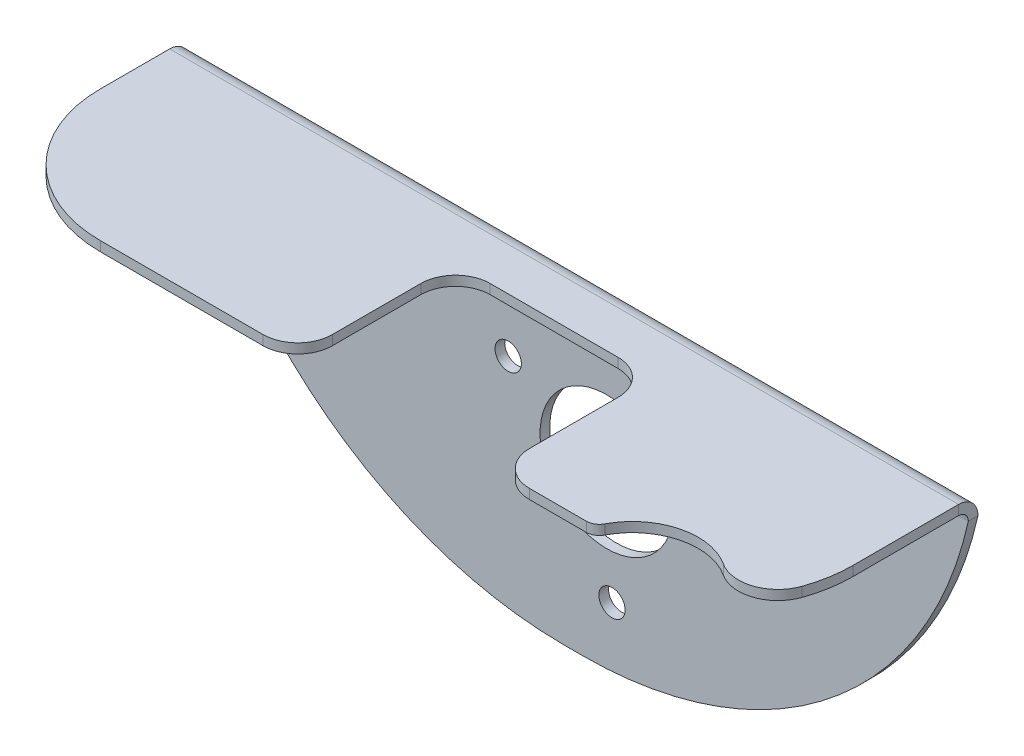
ISO-10303-21;
HEADER;
FILE_DESCRIPTION(('STEP AP214'),'2;1');
FILE_NAME('part.step','',(''),(''),'','','');
FILE_SCHEMA(('AUTOMOTIVE_DESIGN { 1 0 10303 214 1 1 1 1 }'));
ENDSEC;
DATA;
#1=APPLICATION_CONTEXT('core data for automotive mechanical design processes');
#2=APPLICATION_PROTOCOL_DEFINITION('international standard','automotive_design',2000,#1);
#3=PRODUCT_CONTEXT('',#1,'mechanical');
#4=PRODUCT('Part','Part','',(#3));
#5=PRODUCT_RELATED_PRODUCT_CATEGORY('part','',(#4));
#6=PRODUCT_DEFINITION_FORMATION('','',#4);
#7=PRODUCT_DEFINITION_CONTEXT('part definition',#1,'design');
#8=PRODUCT_DEFINITION('design','',#6,#7);
#9=PRODUCT_DEFINITION_SHAPE('','',#8);
#10=(LENGTH_UNIT() NAMED_UNIT(*) SI_UNIT(.MILLI.,.METRE.));
#11=(NAMED_UNIT(*) PLANE_ANGLE_UNIT() SI_UNIT($,.RADIAN.));
#12=(NAMED_UNIT(*) SI_UNIT($,.STERADIAN.) SOLID_ANGLE_UNIT());
#13=UNCERTAINTY_MEASURE_WITH_UNIT(LENGTH_MEASURE(1.E-05),#10,'distance_accuracy_value','');
#14=(GEOMETRIC_REPRESENTATION_CONTEXT(3) GLOBAL_UNCERTAINTY_ASSIGNED_CONTEXT((#13)) GLOBAL_UNIT_ASSIGNED_CONTEXT((#10,
#11,#12)) REPRESENTATION_CONTEXT('',''));
#15=CARTESIAN_POINT('',(0.,0.,0.));
#16=DIRECTION('',(0.,0.,1.));
#17=DIRECTION('',(1.,0.,0.));
#18=AXIS2_PLACEMENT_3D('',#15,#16,#17);
#19=CARTESIAN_POINT('',(12.6335741699428,-0.7366,7.5));
#20=DIRECTION('',(0.,0.,1.));
#21=DIRECTION('',(1.,0.,0.));
#22=AXIS2_PLACEMENT_3D('',#19,#20,#21);
#23=PLANE('',#22);
#24=DIRECTION('',(1.,0.,0.));
#25=VECTOR('',#24,1.);
#26=CARTESIAN_POINT('',(12.6335741699428,-0.7366,7.5));
#27=LINE('',#26,#25);
#28=CARTESIAN_POINT('',(12.6335741699428,-0.7366,7.5));
#29=VERTEX_POINT('',#28);
#30=CARTESIAN_POINT('',(16.9493208635028,-0.7366,7.5));
#31=VERTEX_POINT('',#30);
#32=EDGE_CURVE('E354',#29,#31,#27,.T.);
#33=ORIENTED_EDGE('',*,*,#32,.T.);
#34=DIRECTION('',(0.,-1.,0.));
#35=VECTOR('',#34,1.);
#36=CARTESIAN_POINT('',(16.9493208635028,-0.7366,7.5));
#37=LINE('',#36,#35);
#38=CARTESIAN_POINT('',(16.9493208635028,0.,7.5));
#39=VERTEX_POINT('',#38);
#40=EDGE_CURVE('E65',#31,#39,#37,.F.);
#41=ORIENTED_EDGE('',*,*,#40,.T.);
#42=DIRECTION('',(1.,0.,0.));
#43=VECTOR('',#42,1.);
#44=CARTESIAN_POINT('',(12.6335741699428,0.,7.5));
#45=LINE('',#44,#43);
#46=CARTESIAN_POINT('',(12.6335741699428,0.,7.5));
#47=VERTEX_POINT('',#46);
#48=EDGE_CURVE('E328',#47,#39,#45,.T.);
#49=ORIENTED_EDGE('',*,*,#48,.F.);
#50=DIRECTION('',(0.,1.,0.));
#51=VECTOR('',#50,1.);
#52=CARTESIAN_POINT('',(12.6335741699428,-0.7366,7.5));
#53=LINE('',#52,#51);
#54=EDGE_CURVE('E385',#29,#47,#53,.T.);
#55=ORIENTED_EDGE('',*,*,#54,.F.);
#56=EDGE_LOOP('',(#33,#41,#49,#55));
#57=FACE_BOUND('',#56,.T.);
#58=ADVANCED_FACE('F57',(#57),#23,.T.);
#59=CARTESIAN_POINT('',(-7.63357416994275,-0.7366,4.86642583005725));
#60=DIRECTION('',(0.,-1.,0.));
#61=DIRECTION('',(0.,0.,-1.));
#62=AXIS2_PLACEMENT_3D('',#59,#60,#61);
#63=PLANE('',#62);
#64=CARTESIAN_POINT('',(22.2559156418227,-0.7366,9.30000925693092));
#65=DIRECTION('',(0.,-1.,0.));
#66=DIRECTION('',(0.,0.,-1.));
#67=AXIS2_PLACEMENT_3D('',#64,#65,#66);
#68=CIRCLE('',#67,4.99999999834926);
#69=CARTESIAN_POINT('',(17.8337533267995,-0.7366,6.96666820961688));
#70=VERTEX_POINT('',#69);
#71=CARTESIAN_POINT('',(24.9766636515534,-0.7366,5.10506822623223));
#72=VERTEX_POINT('',#71);
#73=EDGE_CURVE('E277',#70,#72,#68,.T.);
#74=ORIENTED_EDGE('',*,*,#73,.F.);
#75=CARTESIAN_POINT('',(16.9493208635028,-0.7366,6.5));
#76=DIRECTION('',(0.,-1.,0.));
#77=DIRECTION('',(0.,0.,-1.));
#78=AXIS2_PLACEMENT_3D('',#75,#76,#77);
#79=CIRCLE('',#78,1.);
#80=EDGE_CURVE('E79',#70,#31,#79,.T.);
#81=ORIENTED_EDGE('',*,*,#80,.T.);
#82=ORIENTED_EDGE('',*,*,#32,.F.);
#83=CARTESIAN_POINT('',(12.6335741699428,-0.7366,4.86642583005725));
#84=DIRECTION('',(0.,1.,0.));
#85=DIRECTION('',(0.,0.,1.));
#86=AXIS2_PLACEMENT_3D('',#83,#84,#85);
#87=CIRCLE('',#86,2.63357416994275);
#88=CARTESIAN_POINT('',(10.,-0.7366,4.86642583005725));
#89=VERTEX_POINT('',#88);
#90=EDGE_CURVE('E351',#89,#29,#87,.T.);
#91=ORIENTED_EDGE('',*,*,#90,.F.);
#92=DIRECTION('',(0.,0.,1.));
#93=VECTOR('',#92,1.);
#94=CARTESIAN_POINT('',(10.,-0.7366,-1.86642583005725));
#95=LINE('',#94,#93);
#96=CARTESIAN_POINT('',(10.,-0.7366,-1.86642583005725));
#97=VERTEX_POINT('',#96);
#98=EDGE_CURVE('E348',#97,#89,#95,.T.);
#99=ORIENTED_EDGE('',*,*,#98,.F.);
#100=CARTESIAN_POINT('',(7.36642583005725,-0.7366,-1.86642583005725));
#101=DIRECTION('',(0.,-1.,0.));
#102=DIRECTION('',(0.,0.,-1.));
#103=AXIS2_PLACEMENT_3D('',#100,#101,#102);
#104=CIRCLE('',#103,2.63357416994275);
#105=CARTESIAN_POINT('',(7.36642583005725,-0.7366,-4.5));
#106=VERTEX_POINT('',#105);
#107=EDGE_CURVE('E345',#106,#97,#104,.T.);
#108=ORIENTED_EDGE('',*,*,#107,.F.);
#109=DIRECTION('',(1.,0.,0.));
#110=VECTOR('',#109,1.);
#111=CARTESIAN_POINT('',(-2.36642583005725,-0.7366,-4.5));
#112=LINE('',#111,#110);
#113=CARTESIAN_POINT('',(-2.36642583005725,-0.7366,-4.5));
#114=VERTEX_POINT('',#113);
#115=EDGE_CURVE('E342',#114,#106,#112,.T.);
#116=ORIENTED_EDGE('',*,*,#115,.F.);
#117=CARTESIAN_POINT('',(-2.36642583005725,-0.7366,-1.86642583005725));
#118=DIRECTION('',(0.,-1.,0.));
#119=DIRECTION('',(0.,0.,-1.));
#120=AXIS2_PLACEMENT_3D('',#117,#118,#119);
#121=CIRCLE('',#120,2.63357416994275);
#122=CARTESIAN_POINT('',(-5.,-0.7366,-1.86642583005725));
#123=VERTEX_POINT('',#122);
#124=EDGE_CURVE('E339',#123,#114,#121,.T.);
#125=ORIENTED_EDGE('',*,*,#124,.F.);
#126=DIRECTION('',(0.,0.,-1.));
#127=VECTOR('',#126,1.);
#128=CARTESIAN_POINT('',(-5.,-0.7366,-1.86642583005725));
#129=LINE('',#128,#127);
#130=CARTESIAN_POINT('',(-5.,-0.7366,4.86642583005725));
#131=VERTEX_POINT('',#130);
#132=EDGE_CURVE('E336',#131,#123,#129,.T.);
#133=ORIENTED_EDGE('',*,*,#132,.F.);
#134=CARTESIAN_POINT('',(-7.63357416994275,-0.7366,4.86642583005725));
#135=DIRECTION('',(0.,1.,0.));
#136=DIRECTION('',(0.,0.,-1.));
#137=AXIS2_PLACEMENT_3D('',#134,#135,#136);
#138=CIRCLE('',#137,2.63357416994275);
#139=CARTESIAN_POINT('',(-7.63357416994275,-0.7366,7.5));
#140=VERTEX_POINT('',#139);
#141=EDGE_CURVE('E333',#140,#131,#138,.T.);
#142=ORIENTED_EDGE('',*,*,#141,.F.);
#143=DIRECTION('',(1.,0.,0.));
#144=VECTOR('',#143,1.);
#145=CARTESIAN_POINT('',(-30.,-0.7366,7.5));
#146=LINE('',#145,#144);
#147=CARTESIAN_POINT('',(-20.,-0.7366,7.5));
#148=VERTEX_POINT('',#147);
#149=EDGE_CURVE('E331',#148,#140,#146,.T.);
#150=ORIENTED_EDGE('',*,*,#149,.F.);
#151=CARTESIAN_POINT('',(-20.,-0.7366,-2.5));
#152=DIRECTION('',(0.,-1.,0.));
#153=DIRECTION('',(0.,0.,-1.));
#154=AXIS2_PLACEMENT_3D('',#151,#152,#153);
#155=CIRCLE('',#154,10.);
#156=CARTESIAN_POINT('',(-30.,-0.7366,-2.5));
#157=VERTEX_POINT('',#156);
#158=EDGE_CURVE('E250',#148,#157,#155,.T.);
#159=ORIENTED_EDGE('',*,*,#158,.T.);
#160=DIRECTION('',(0.,0.,1.));
#161=VECTOR('',#160,1.);
#162=CARTESIAN_POINT('',(-30.,-0.7366,7.5));
#163=LINE('',#162,#161);
#164=CARTESIAN_POINT('',(-30.,-0.736600000000003,-7.7634));
#165=VERTEX_POINT('',#164);
#166=EDGE_CURVE('E327',#165,#157,#163,.T.);
#167=ORIENTED_EDGE('',*,*,#166,.F.);
#168=DIRECTION('',(1.,0.,0.));
#169=VECTOR('',#168,1.);
#170=CARTESIAN_POINT('',(30.,-0.736600000000003,-7.7634));
#171=LINE('',#170,#169);
#172=CARTESIAN_POINT('',(30.,-0.736600000000003,-7.7634));
#173=VERTEX_POINT('',#172);
#174=EDGE_CURVE('E317',#173,#165,#171,.F.);
#175=ORIENTED_EDGE('',*,*,#174,.F.);
#176=DIRECTION('',(0.,0.,-1.));
#177=VECTOR('',#176,1.);
#178=CARTESIAN_POINT('',(30.,-0.7366,7.5));
#179=LINE('',#178,#177);
#180=CARTESIAN_POINT('',(30.,-0.7366,0.281670751157906));
#181=VERTEX_POINT('',#180);
#182=EDGE_CURVE('E325',#181,#173,#179,.T.);
#183=ORIENTED_EDGE('',*,*,#182,.F.);
#184=CARTESIAN_POINT('',(20.,-0.7366,0.281670751157906));
#185=DIRECTION('',(0.,-1.,0.));
#186=DIRECTION('',(0.,0.,-1.));
#187=AXIS2_PLACEMENT_3D('',#184,#185,#186);
#188=CIRCLE('',#187,10.);
#189=CARTESIAN_POINT('',(29.4415892256153,-0.7366,3.57657483090668));
#190=VERTEX_POINT('',#189);
#191=EDGE_CURVE('E256',#181,#190,#188,.T.);
#192=ORIENTED_EDGE('',*,*,#191,.T.);
#193=CARTESIAN_POINT('',(26.6091124579307,-0.7366,2.58810360698205));
#194=DIRECTION('',(0.,-1.,0.));
#195=DIRECTION('',(0.,0.,-1.));
#196=AXIS2_PLACEMENT_3D('',#193,#194,#195);
#197=CIRCLE('',#196,3.);
#198=EDGE_CURVE('E262',#190,#72,#197,.T.);
#199=ORIENTED_EDGE('',*,*,#198,.T.);
#200=EDGE_LOOP('',(#74,#81,#82,#91,#99,#108,#116,#125,#133,#142,#150,#159,#167,#175,#183,#192,#199));
#201=FACE_BOUND('',#200,.T.);
#202=ADVANCED_FACE('F281',(#201),#63,.T.);
#203=CARTESIAN_POINT('',(-7.63357416994275,0.,4.86642583005725));
#204=DIRECTION('',(0.,-1.,0.));
#205=DIRECTION('',(0.,0.,-1.));
#206=AXIS2_PLACEMENT_3D('',#203,#204,#205);
#207=PLANE('',#206);
#208=ORIENTED_EDGE('',*,*,#48,.T.);
#209=CARTESIAN_POINT('',(16.9493208635028,0.,6.5));
#210=DIRECTION('',(0.,-1.,0.));
#211=DIRECTION('',(0.,0.,-1.));
#212=AXIS2_PLACEMENT_3D('',#209,#210,#211);
#213=CIRCLE('',#212,1.);
#214=CARTESIAN_POINT('',(17.8337533267995,0.,6.96666820961688));
#215=VERTEX_POINT('',#214);
#216=EDGE_CURVE('E13',#39,#215,#213,.F.);
#217=ORIENTED_EDGE('',*,*,#216,.T.);
#218=CARTESIAN_POINT('',(22.2559156418227,0.,9.30000925693092));
#219=DIRECTION('',(0.,-1.,0.));
#220=DIRECTION('',(0.,0.,-1.));
#221=AXIS2_PLACEMENT_3D('',#218,#219,#220);
#222=CIRCLE('',#221,4.99999999834926);
#223=CARTESIAN_POINT('',(24.9766636515534,0.,5.10506822623223));
#224=VERTEX_POINT('',#223);
#225=EDGE_CURVE('E278',#215,#224,#222,.T.);
#226=ORIENTED_EDGE('',*,*,#225,.T.);
#227=CARTESIAN_POINT('',(26.6091124579307,0.,2.58810360698205));
#228=DIRECTION('',(0.,-1.,0.));
#229=DIRECTION('',(0.,0.,-1.));
#230=AXIS2_PLACEMENT_3D('',#227,#228,#229);
#231=CIRCLE('',#230,3.);
#232=CARTESIAN_POINT('',(29.4415892256153,0.,3.57657483090668));
#233=VERTEX_POINT('',#232);
#234=EDGE_CURVE('E268',#224,#233,#231,.F.);
#235=ORIENTED_EDGE('',*,*,#234,.T.);
#236=CARTESIAN_POINT('',(20.,0.,0.281670751157906));
#237=DIRECTION('',(0.,-1.,0.));
#238=DIRECTION('',(0.,0.,-1.));
#239=AXIS2_PLACEMENT_3D('',#236,#237,#238);
#240=CIRCLE('',#239,10.);
#241=CARTESIAN_POINT('',(30.,0.,0.281670751157906));
#242=VERTEX_POINT('',#241);
#243=EDGE_CURVE('E252',#233,#242,#240,.F.);
#244=ORIENTED_EDGE('',*,*,#243,.T.);
#245=DIRECTION('',(0.,0.,-1.));
#246=VECTOR('',#245,1.);
#247=CARTESIAN_POINT('',(30.,0.,7.5));
#248=LINE('',#247,#246);
#249=CARTESIAN_POINT('',(30.,0.,-7.7634));
#250=VERTEX_POINT('',#249);
#251=EDGE_CURVE('E323',#242,#250,#248,.T.);
#252=ORIENTED_EDGE('',*,*,#251,.T.);
#253=DIRECTION('',(1.,0.,0.));
#254=VECTOR('',#253,1.);
#255=CARTESIAN_POINT('',(30.,0.,-7.7634));
#256=LINE('',#255,#254);
#257=CARTESIAN_POINT('',(-30.,0.,-7.7634));
#258=VERTEX_POINT('',#257);
#259=EDGE_CURVE('E208',#250,#258,#256,.F.);
#260=ORIENTED_EDGE('',*,*,#259,.T.);
#261=DIRECTION('',(0.,0.,1.));
#262=VECTOR('',#261,1.);
#263=CARTESIAN_POINT('',(-30.,0.,7.5));
#264=LINE('',#263,#262);
#265=CARTESIAN_POINT('',(-30.,0.,-2.5));
#266=VERTEX_POINT('',#265);
#267=EDGE_CURVE('E358',#258,#266,#264,.T.);
#268=ORIENTED_EDGE('',*,*,#267,.T.);
#269=CARTESIAN_POINT('',(-20.,0.,-2.5));
#270=DIRECTION('',(0.,-1.,0.));
#271=DIRECTION('',(0.,0.,-1.));
#272=AXIS2_PLACEMENT_3D('',#269,#270,#271);
#273=CIRCLE('',#272,10.);
#274=CARTESIAN_POINT('',(-20.,0.,7.5));
#275=VERTEX_POINT('',#274);
#276=EDGE_CURVE('E246',#266,#275,#273,.F.);
#277=ORIENTED_EDGE('',*,*,#276,.T.);
#278=DIRECTION('',(1.,0.,0.));
#279=VECTOR('',#278,1.);
#280=CARTESIAN_POINT('',(-30.,0.,7.5));
#281=LINE('',#280,#279);
#282=CARTESIAN_POINT('',(-7.63357416994275,0.,7.5));
#283=VERTEX_POINT('',#282);
#284=EDGE_CURVE('E361',#275,#283,#281,.T.);
#285=ORIENTED_EDGE('',*,*,#284,.T.);
#286=CARTESIAN_POINT('',(-7.63357416994275,0.,4.86642583005725));
#287=DIRECTION('',(0.,1.,0.));
#288=DIRECTION('',(0.,0.,-1.));
#289=AXIS2_PLACEMENT_3D('',#286,#287,#288);
#290=CIRCLE('',#289,2.63357416994275);
#291=CARTESIAN_POINT('',(-5.,0.,4.86642583005725));
#292=VERTEX_POINT('',#291);
#293=EDGE_CURVE('E363',#283,#292,#290,.T.);
#294=ORIENTED_EDGE('',*,*,#293,.T.);
#295=DIRECTION('',(0.,0.,-1.));
#296=VECTOR('',#295,1.);
#297=CARTESIAN_POINT('',(-5.,0.,-1.86642583005725));
#298=LINE('',#297,#296);
#299=CARTESIAN_POINT('',(-5.,0.,-1.86642583005725));
#300=VERTEX_POINT('',#299);
#301=EDGE_CURVE('E366',#292,#300,#298,.T.);
#302=ORIENTED_EDGE('',*,*,#301,.T.);
#303=CARTESIAN_POINT('',(-2.36642583005725,0.,-1.86642583005725));
#304=DIRECTION('',(0.,-1.,0.));
#305=DIRECTION('',(0.,0.,-1.));
#306=AXIS2_PLACEMENT_3D('',#303,#304,#305);
#307=CIRCLE('',#306,2.63357416994275);
#308=CARTESIAN_POINT('',(-2.36642583005725,0.,-4.5));
#309=VERTEX_POINT('',#308);
#310=EDGE_CURVE('E369',#300,#309,#307,.T.);
#311=ORIENTED_EDGE('',*,*,#310,.T.);
#312=DIRECTION('',(1.,0.,0.));
#313=VECTOR('',#312,1.);
#314=CARTESIAN_POINT('',(-2.36642583005725,0.,-4.5));
#315=LINE('',#314,#313);
#316=CARTESIAN_POINT('',(7.36642583005725,0.,-4.5));
#317=VERTEX_POINT('',#316);
#318=EDGE_CURVE('E372',#309,#317,#315,.T.);
#319=ORIENTED_EDGE('',*,*,#318,.T.);
#320=CARTESIAN_POINT('',(7.36642583005725,0.,-1.86642583005725));
#321=DIRECTION('',(0.,-1.,0.));
#322=DIRECTION('',(0.,0.,-1.));
#323=AXIS2_PLACEMENT_3D('',#320,#321,#322);
#324=CIRCLE('',#323,2.63357416994275);
#325=CARTESIAN_POINT('',(10.,0.,-1.86642583005725));
#326=VERTEX_POINT('',#325);
#327=EDGE_CURVE('E375',#317,#326,#324,.T.);
#328=ORIENTED_EDGE('',*,*,#327,.T.);
#329=DIRECTION('',(0.,0.,1.));
#330=VECTOR('',#329,1.);
#331=CARTESIAN_POINT('',(10.,0.,-1.86642583005725));
#332=LINE('',#331,#330);
#333=CARTESIAN_POINT('',(10.,0.,4.86642583005725));
#334=VERTEX_POINT('',#333);
#335=EDGE_CURVE('E378',#326,#334,#332,.T.);
#336=ORIENTED_EDGE('',*,*,#335,.T.);
#337=CARTESIAN_POINT('',(12.6335741699428,0.,4.86642583005725));
#338=DIRECTION('',(0.,1.,0.));
#339=DIRECTION('',(0.,0.,1.));
#340=AXIS2_PLACEMENT_3D('',#337,#338,#339);
#341=CIRCLE('',#340,2.63357416994275);
#342=EDGE_CURVE('E381',#334,#47,#341,.T.);
#343=ORIENTED_EDGE('',*,*,#342,.T.);
#344=EDGE_LOOP('',(#208,#217,#226,#235,#244,#252,#260,#268,#277,#285,#294,#302,#311,#319,#328,
#336,#343));
#345=FACE_BOUND('',#344,.T.);
#346=ADVANCED_FACE('F437',(#345),#207,.F.);
#347=CARTESIAN_POINT('',(30.,-0.7366,7.5));
#348=DIRECTION('',(1.,0.,0.));
#349=DIRECTION('',(0.,0.,-1.));
#350=AXIS2_PLACEMENT_3D('',#347,#348,#349);
#351=PLANE('',#350);
#352=ORIENTED_EDGE('',*,*,#251,.F.);
#353=DIRECTION('',(0.,1.,0.));
#354=VECTOR('',#353,1.);
#355=CARTESIAN_POINT('',(30.,-0.7366,0.281670751157906));
#356=LINE('',#355,#354);
#357=EDGE_CURVE('E254',#242,#181,#356,.F.);
#358=ORIENTED_EDGE('',*,*,#357,.T.);
#359=ORIENTED_EDGE('',*,*,#182,.T.);
#360=DIRECTION('',(0.,1.,0.));
#361=VECTOR('',#360,1.);
#362=CARTESIAN_POINT('',(30.,-0.736600000000003,-7.7634));
#363=LINE('',#362,#361);
#364=EDGE_CURVE('E313',#173,#250,#363,.T.);
#365=ORIENTED_EDGE('',*,*,#364,.T.);
#366=EDGE_LOOP('',(#352,#358,#359,#365));
#367=FACE_BOUND('',#366,.T.);
#368=ADVANCED_FACE('F442',(#367),#351,.T.);
#369=CARTESIAN_POINT('',(12.6335741699428,-0.7366,4.86642583005725));
#370=DIRECTION('',(0.,1.,0.));
#371=DIRECTION('',(0.,0.,1.));
#372=AXIS2_PLACEMENT_3D('',#369,#370,#371);
#373=CYLINDRICAL_SURFACE('',#372,2.63357416994275);
#374=ORIENTED_EDGE('',*,*,#342,.F.);
#375=DIRECTION('',(0.,1.,0.));
#376=VECTOR('',#375,1.);
#377=CARTESIAN_POINT('',(10.,-0.7366,4.86642583005725));
#378=LINE('',#377,#376);
#379=EDGE_CURVE('E388',#89,#334,#378,.T.);
#380=ORIENTED_EDGE('',*,*,#379,.F.);
#381=ORIENTED_EDGE('',*,*,#90,.T.);
#382=ORIENTED_EDGE('',*,*,#54,.T.);
#383=EDGE_LOOP('',(#374,#380,#381,#382));
#384=FACE_BOUND('',#383,.T.);
#385=ADVANCED_FACE('F465',(#384),#373,.T.);
#386=CARTESIAN_POINT('',(10.,-0.7366,-1.86642583005725));
#387=DIRECTION('',(-1.,0.,0.));
#388=DIRECTION('',(0.,0.,1.));
#389=AXIS2_PLACEMENT_3D('',#386,#387,#388);
#390=PLANE('',#389);
#391=ORIENTED_EDGE('',*,*,#335,.F.);
#392=DIRECTION('',(0.,1.,0.));
#393=VECTOR('',#392,1.);
#394=CARTESIAN_POINT('',(10.,-0.7366,-1.86642583005725));
#395=LINE('',#394,#393);
#396=EDGE_CURVE('E390',#97,#326,#395,.T.);
#397=ORIENTED_EDGE('',*,*,#396,.F.);
#398=ORIENTED_EDGE('',*,*,#98,.T.);
#399=ORIENTED_EDGE('',*,*,#379,.T.);
#400=EDGE_LOOP('',(#391,#397,#398,#399));
#401=FACE_BOUND('',#400,.T.);
#402=ADVANCED_FACE('F468',(#401),#390,.T.);
#403=CARTESIAN_POINT('',(7.36642583005725,-0.7366,-1.86642583005725));
#404=DIRECTION('',(0.,1.,0.));
#405=DIRECTION('',(0.,0.,1.));
#406=AXIS2_PLACEMENT_3D('',#403,#404,#405);
#407=CYLINDRICAL_SURFACE('',#406,2.63357416994275);
#408=ORIENTED_EDGE('',*,*,#327,.F.);
#409=DIRECTION('',(0.,1.,0.));
#410=VECTOR('',#409,1.);
#411=CARTESIAN_POINT('',(7.36642583005725,-0.7366,-4.5));
#412=LINE('',#411,#410);
#413=EDGE_CURVE('E392',#106,#317,#412,.T.);
#414=ORIENTED_EDGE('',*,*,#413,.F.);
#415=ORIENTED_EDGE('',*,*,#107,.T.);
#416=ORIENTED_EDGE('',*,*,#396,.T.);
#417=EDGE_LOOP('',(#408,#414,#415,#416));
#418=FACE_BOUND('',#417,.T.);
#419=ADVANCED_FACE('F472',(#418),#407,.F.);
#420=CARTESIAN_POINT('',(-2.36642583005725,-0.7366,-4.5));
#421=DIRECTION('',(0.,0.,1.));
#422=DIRECTION('',(1.,0.,0.));
#423=AXIS2_PLACEMENT_3D('',#420,#421,#422);
#424=PLANE('',#423);
#425=ORIENTED_EDGE('',*,*,#318,.F.);
#426=DIRECTION('',(0.,1.,0.));
#427=VECTOR('',#426,1.);
#428=CARTESIAN_POINT('',(-2.36642583005725,-0.7366,-4.5));
#429=LINE('',#428,#427);
#430=EDGE_CURVE('E394',#114,#309,#429,.T.);
#431=ORIENTED_EDGE('',*,*,#430,.F.);
#432=ORIENTED_EDGE('',*,*,#115,.T.);
#433=ORIENTED_EDGE('',*,*,#413,.T.);
#434=EDGE_LOOP('',(#425,#431,#432,#433));
#435=FACE_BOUND('',#434,.T.);
#436=ADVANCED_FACE('F476',(#435),#424,.T.);
#437=CARTESIAN_POINT('',(-2.36642583005725,-0.7366,-1.86642583005725));
#438=DIRECTION('',(0.,1.,0.));
#439=DIRECTION('',(0.,0.,1.));
#440=AXIS2_PLACEMENT_3D('',#437,#438,#439);
#441=CYLINDRICAL_SURFACE('',#440,2.63357416994275);
#442=ORIENTED_EDGE('',*,*,#310,.F.);
#443=DIRECTION('',(0.,1.,0.));
#444=VECTOR('',#443,1.);
#445=CARTESIAN_POINT('',(-5.,-0.7366,-1.86642583005725));
#446=LINE('',#445,#444);
#447=EDGE_CURVE('E396',#123,#300,#446,.T.);
#448=ORIENTED_EDGE('',*,*,#447,.F.);
#449=ORIENTED_EDGE('',*,*,#124,.T.);
#450=ORIENTED_EDGE('',*,*,#430,.T.);
#451=EDGE_LOOP('',(#442,#448,#449,#450));
#452=FACE_BOUND('',#451,.T.);
#453=ADVANCED_FACE('F480',(#452),#441,.F.);
#454=CARTESIAN_POINT('',(-5.,-0.7366,-1.86642583005725));
#455=DIRECTION('',(1.,0.,0.));
#456=DIRECTION('',(0.,0.,-1.));
#457=AXIS2_PLACEMENT_3D('',#454,#455,#456);
#458=PLANE('',#457);
#459=ORIENTED_EDGE('',*,*,#301,.F.);
#460=DIRECTION('',(0.,1.,0.));
#461=VECTOR('',#460,1.);
#462=CARTESIAN_POINT('',(-5.,-0.7366,4.86642583005725));
#463=LINE('',#462,#461);
#464=EDGE_CURVE('E398',#131,#292,#463,.T.);
#465=ORIENTED_EDGE('',*,*,#464,.F.);
#466=ORIENTED_EDGE('',*,*,#132,.T.);
#467=ORIENTED_EDGE('',*,*,#447,.T.);
#468=EDGE_LOOP('',(#459,#465,#466,#467));
#469=FACE_BOUND('',#468,.T.);
#470=ADVANCED_FACE('F484',(#469),#458,.T.);
#471=CARTESIAN_POINT('',(-7.63357416994275,-0.7366,4.86642583005725));
#472=DIRECTION('',(0.,1.,0.));
#473=DIRECTION('',(0.,0.,1.));
#474=AXIS2_PLACEMENT_3D('',#471,#472,#473);
#475=CYLINDRICAL_SURFACE('',#474,2.63357416994275);
#476=ORIENTED_EDGE('',*,*,#293,.F.);
#477=DIRECTION('',(0.,1.,0.));
#478=VECTOR('',#477,1.);
#479=CARTESIAN_POINT('',(-7.63357416994275,-0.7366,7.5));
#480=LINE('',#479,#478);
#481=EDGE_CURVE('E356',#140,#283,#480,.T.);
#482=ORIENTED_EDGE('',*,*,#481,.F.);
#483=ORIENTED_EDGE('',*,*,#141,.T.);
#484=ORIENTED_EDGE('',*,*,#464,.T.);
#485=EDGE_LOOP('',(#476,#482,#483,#484));
#486=FACE_BOUND('',#485,.T.);
#487=ADVANCED_FACE('F488',(#486),#475,.T.);
#488=CARTESIAN_POINT('',(-30.,-0.7366,7.5));
#489=DIRECTION('',(0.,0.,1.));
#490=DIRECTION('',(1.,0.,0.));
#491=AXIS2_PLACEMENT_3D('',#488,#489,#490);
#492=PLANE('',#491);
#493=ORIENTED_EDGE('',*,*,#284,.F.);
#494=DIRECTION('',(0.,1.,0.));
#495=VECTOR('',#494,1.);
#496=CARTESIAN_POINT('',(-20.,-0.7366,7.5));
#497=LINE('',#496,#495);
#498=EDGE_CURVE('E248',#275,#148,#497,.F.);
#499=ORIENTED_EDGE('',*,*,#498,.T.);
#500=ORIENTED_EDGE('',*,*,#149,.T.);
#501=ORIENTED_EDGE('',*,*,#481,.T.);
#502=EDGE_LOOP('',(#493,#499,#500,#501));
#503=FACE_BOUND('',#502,.T.);
#504=ADVANCED_FACE('F492',(#503),#492,.T.);
#505=CARTESIAN_POINT('',(-30.,-0.7366,7.5));
#506=DIRECTION('',(-1.,0.,0.));
#507=DIRECTION('',(0.,0.,1.));
#508=AXIS2_PLACEMENT_3D('',#505,#506,#507);
#509=PLANE('',#508);
#510=ORIENTED_EDGE('',*,*,#166,.T.);
#511=DIRECTION('',(0.,1.,0.));
#512=VECTOR('',#511,1.);
#513=CARTESIAN_POINT('',(-30.,-0.7366,-2.5));
#514=LINE('',#513,#512);
#515=EDGE_CURVE('E239',#157,#266,#514,.T.);
#516=ORIENTED_EDGE('',*,*,#515,.T.);
#517=ORIENTED_EDGE('',*,*,#267,.F.);
#518=DIRECTION('',(0.,1.,0.));
#519=VECTOR('',#518,1.);
#520=CARTESIAN_POINT('',(-30.,-0.736600000000003,-7.7634));
#521=LINE('',#520,#519);
#522=EDGE_CURVE('E320',#165,#258,#521,.T.);
#523=ORIENTED_EDGE('',*,*,#522,.F.);
#524=EDGE_LOOP('',(#510,#516,#517,#523));
#525=FACE_BOUND('',#524,.T.);
#526=ADVANCED_FACE('F435',(#525),#509,.T.);
#527=CARTESIAN_POINT('',(-30.,-1.4732,-7.7634));
#528=DIRECTION('',(-1.,0.,0.));
#529=DIRECTION('',(0.,0.,1.));
#530=AXIS2_PLACEMENT_3D('',#527,#528,#529);
#531=PLANE('',#530);
#532=DIRECTION('',(0.,0.,1.));
#533=VECTOR('',#532,1.);
#534=CARTESIAN_POINT('',(-30.,-1.47319999999999,-9.23660000000001));
#535=LINE('',#534,#533);
#536=CARTESIAN_POINT('',(-30.,-1.4732,-8.5));
#537=VERTEX_POINT('',#536);
#538=CARTESIAN_POINT('',(-30.,-1.4732,-9.2366));
#539=VERTEX_POINT('',#538);
#540=EDGE_CURVE('E308',#537,#539,#535,.F.);
#541=ORIENTED_EDGE('',*,*,#540,.F.);
#542=CARTESIAN_POINT('',(-30.,-1.4732,-7.7634));
#543=DIRECTION('',(1.,0.,0.));
#544=DIRECTION('',(0.,0.,-1.));
#545=AXIS2_PLACEMENT_3D('',#542,#543,#544);
#546=CIRCLE('',#545,0.736600000000001);
#547=EDGE_CURVE('E212',#165,#537,#546,.F.);
#548=ORIENTED_EDGE('',*,*,#547,.F.);
#549=ORIENTED_EDGE('',*,*,#522,.T.);
#550=CARTESIAN_POINT('',(-30.,-1.4732,-7.7634));
#551=DIRECTION('',(1.,0.,0.));
#552=DIRECTION('',(0.,0.,-1.));
#553=AXIS2_PLACEMENT_3D('',#550,#551,#552);
#554=CIRCLE('',#553,1.4732);
#555=EDGE_CURVE('E312',#258,#539,#554,.F.);
#556=ORIENTED_EDGE('',*,*,#555,.T.);
#557=EDGE_LOOP('',(#541,#548,#549,#556));
#558=FACE_BOUND('',#557,.T.);
#559=ADVANCED_FACE('F422',(#558),#531,.T.);
#560=CARTESIAN_POINT('',(30.,-1.4732,-7.7634));
#561=DIRECTION('',(-1.,0.,0.));
#562=DIRECTION('',(0.,0.,1.));
#563=AXIS2_PLACEMENT_3D('',#560,#561,#562);
#564=PLANE('',#563);
#565=CARTESIAN_POINT('',(30.,-1.4732,-7.7634));
#566=DIRECTION('',(1.,0.,0.));
#567=DIRECTION('',(0.,0.,-1.));
#568=AXIS2_PLACEMENT_3D('',#565,#566,#567);
#569=CIRCLE('',#568,0.736600000000001);
#570=CARTESIAN_POINT('',(30.,-1.4732,-8.5));
#571=VERTEX_POINT('',#570);
#572=EDGE_CURVE('E219',#571,#173,#569,.T.);
#573=ORIENTED_EDGE('',*,*,#572,.F.);
#574=DIRECTION('',(0.,0.,1.));
#575=VECTOR('',#574,1.);
#576=CARTESIAN_POINT('',(30.,-1.4732,-8.5));
#577=LINE('',#576,#575);
#578=CARTESIAN_POINT('',(30.,-1.47319999999999,-9.2366));
#579=VERTEX_POINT('',#578);
#580=EDGE_CURVE('E216',#571,#579,#577,.F.);
#581=ORIENTED_EDGE('',*,*,#580,.T.);
#582=CARTESIAN_POINT('',(30.,-1.4732,-7.7634));
#583=DIRECTION('',(1.,0.,0.));
#584=DIRECTION('',(0.,0.,-1.));
#585=AXIS2_PLACEMENT_3D('',#582,#583,#584);
#586=CIRCLE('',#585,1.4732);
#587=EDGE_CURVE('E201',#579,#250,#586,.T.);
#588=ORIENTED_EDGE('',*,*,#587,.T.);
#589=ORIENTED_EDGE('',*,*,#364,.F.);
#590=EDGE_LOOP('',(#573,#581,#588,#589));
#591=FACE_BOUND('',#590,.T.);
#592=ADVANCED_FACE('F217',(#591),#564,.F.);
#593=CARTESIAN_POINT('',(30.,-1.4732,-7.7634));
#594=DIRECTION('',(1.,0.,0.));
#595=DIRECTION('',(0.,0.,-1.));
#596=AXIS2_PLACEMENT_3D('',#593,#594,#595);
#597=CYLINDRICAL_SURFACE('',#596,1.4732);
#598=ORIENTED_EDGE('',*,*,#259,.F.);
#599=ORIENTED_EDGE('',*,*,#587,.F.);
#600=DIRECTION('',(1.,0.,0.));
#601=VECTOR('',#600,1.);
#602=CARTESIAN_POINT('',(-30.,-1.47319999999999,-9.2366));
#603=LINE('',#602,#601);
#604=EDGE_CURVE('E205',#579,#539,#603,.F.);
#605=ORIENTED_EDGE('',*,*,#604,.T.);
#606=ORIENTED_EDGE('',*,*,#555,.F.);
#607=EDGE_LOOP('',(#598,#599,#605,#606));
#608=FACE_BOUND('',#607,.T.);
#609=ADVANCED_FACE('F203',(#608),#597,.T.);
#610=CARTESIAN_POINT('',(30.,-1.4732,-7.7634));
#611=DIRECTION('',(1.,0.,0.));
#612=DIRECTION('',(0.,0.,-1.));
#613=AXIS2_PLACEMENT_3D('',#610,#611,#612);
#614=CYLINDRICAL_SURFACE('',#613,0.736600000000001);
#615=ORIENTED_EDGE('',*,*,#174,.T.);
#616=ORIENTED_EDGE('',*,*,#547,.T.);
#617=DIRECTION('',(1.,0.,0.));
#618=VECTOR('',#617,1.);
#619=CARTESIAN_POINT('',(-30.,-1.4732,-8.5));
#620=LINE('',#619,#618);
#621=EDGE_CURVE('E222',#537,#571,#620,.T.);
#622=ORIENTED_EDGE('',*,*,#621,.T.);
#623=ORIENTED_EDGE('',*,*,#572,.T.);
#624=EDGE_LOOP('',(#615,#616,#622,#623));
#625=FACE_BOUND('',#624,.T.);
#626=ADVANCED_FACE('F425',(#625),#614,.F.);
#627=CARTESIAN_POINT('',(0.,0.,-9.2366));
#628=DIRECTION('',(0.,0.,1.));
#629=DIRECTION('',(0.,-1.,0.));
#630=AXIS2_PLACEMENT_3D('',#627,#628,#629);
#631=PLANE('',#630);
#632=CARTESIAN_POINT('',(2.49999999999934,-11.9649999999927,-9.23660000000004));
#633=DIRECTION('',(0.,0.,1.));
#634=DIRECTION('',(1.,0.,0.));
#635=AXIS2_PLACEMENT_3D('',#632,#633,#634);
#636=CIRCLE('',#635,5.07);
#637=CARTESIAN_POINT('',(7.56999999999934,-11.9649999999927,-9.23660000000004));
#638=VERTEX_POINT('',#637);
#639=EDGE_CURVE('E288',#638,#638,#636,.T.);
#640=ORIENTED_EDGE('',*,*,#639,.T.);
#641=EDGE_LOOP('',(#640));
#642=FACE_BOUND('',#641,.T.);
#643=CARTESIAN_POINT('',(2.90184174030994,-20.3847301944875,-9.23660000000007));
#644=DIRECTION('',(0.,0.,-1.));
#645=DIRECTION('',(0.,1.,0.));
#646=AXIS2_PLACEMENT_3D('',#643,#644,#645);
#647=CIRCLE('',#646,1.);
#648=CARTESIAN_POINT('',(2.90184174030994,-19.3847301944875,-9.23660000000006));
#649=VERTEX_POINT('',#648);
#650=EDGE_CURVE('E283',#649,#649,#647,.T.);
#651=ORIENTED_EDGE('',*,*,#650,.F.);
#652=EDGE_LOOP('',(#651));
#653=FACE_BOUND('',#652,.T.);
#654=CARTESIAN_POINT('',(-4.99262111167844,-8.10314005808512,-9.23660000000003));
#655=DIRECTION('',(0.,0.,-1.));
#656=DIRECTION('',(0.,1.,0.));
#657=AXIS2_PLACEMENT_3D('',#654,#655,#656);
#658=CIRCLE('',#657,1.);
#659=CARTESIAN_POINT('',(-4.99262111167844,-7.10314005808512,-9.23660000000002));
#660=VERTEX_POINT('',#659);
#661=EDGE_CURVE('E294',#660,#660,#658,.T.);
#662=ORIENTED_EDGE('',*,*,#661,.F.);
#663=EDGE_LOOP('',(#662));
#664=FACE_BOUND('',#663,.T.);
#665=CARTESIAN_POINT('',(9.59077937130857,-7.4071297472318,-9.23660000000002));
#666=DIRECTION('',(0.,0.,-1.));
#667=DIRECTION('',(0.,1.,0.));
#668=AXIS2_PLACEMENT_3D('',#665,#666,#667);
#669=CIRCLE('',#668,1.);
#670=CARTESIAN_POINT('',(9.59077937130857,-6.4071297472318,-9.23660000000002));
#671=VERTEX_POINT('',#670);
#672=EDGE_CURVE('E298',#671,#671,#669,.T.);
#673=ORIENTED_EDGE('',*,*,#672,.F.);
#674=EDGE_LOOP('',(#673));
#675=FACE_BOUND('',#674,.T.);
#676=DIRECTION('',(-1.,0.,0.));
#677=VECTOR('',#676,1.);
#678=CARTESIAN_POINT('',(0.,-25.,-9.23660000000008));
#679=LINE('',#678,#677);
#680=CARTESIAN_POINT('',(0.706695615550642,-25.,-9.23660000000009));
#681=VERTEX_POINT('',#680);
#682=CARTESIAN_POINT('',(-0.706695615550639,-25.,-9.23660000000009));
#683=VERTEX_POINT('',#682);
#684=EDGE_CURVE('E302',#681,#683,#679,.T.);
#685=ORIENTED_EDGE('',*,*,#684,.T.);
#686=CARTESIAN_POINT('',(-0.706695615550639,5.,-9.23659999999998));
#687=DIRECTION('',(0.,0.,1.));
#688=DIRECTION('',(0.,-1.,0.));
#689=AXIS2_PLACEMENT_3D('',#686,#687,#688);
#690=CIRCLE('',#689,30.);
#691=EDGE_CURVE('E230',#683,#539,#690,.F.);
#692=ORIENTED_EDGE('',*,*,#691,.T.);
#693=ORIENTED_EDGE('',*,*,#604,.F.);
#694=CARTESIAN_POINT('',(0.706695615550642,5.,-9.23659999999998));
#695=DIRECTION('',(0.,0.,1.));
#696=DIRECTION('',(0.,-1.,0.));
#697=AXIS2_PLACEMENT_3D('',#694,#695,#696);
#698=CIRCLE('',#697,30.);
#699=EDGE_CURVE('E227',#579,#681,#698,.F.);
#700=ORIENTED_EDGE('',*,*,#699,.T.);
#701=EDGE_LOOP('',(#685,#692,#693,#700));
#702=FACE_BOUND('',#701,.T.);
#703=ADVANCED_FACE('F226',(#642,#653,#664,#675,#702),#631,.F.);
#704=CARTESIAN_POINT('',(0.,0.,-8.5));
#705=DIRECTION('',(0.,0.,1.));
#706=DIRECTION('',(0.,-1.,0.));
#707=AXIS2_PLACEMENT_3D('',#704,#705,#706);
#708=PLANE('',#707);
#709=CARTESIAN_POINT('',(2.49999999999934,-11.9649999999927,-8.50000000000004));
#710=DIRECTION('',(0.,0.,1.));
#711=DIRECTION('',(1.,0.,0.));
#712=AXIS2_PLACEMENT_3D('',#709,#710,#711);
#713=CIRCLE('',#712,5.07);
#714=CARTESIAN_POINT('',(7.56999999999934,-11.9649999999927,-8.50000000000004));
#715=VERTEX_POINT('',#714);
#716=EDGE_CURVE('E291',#715,#715,#713,.T.);
#717=ORIENTED_EDGE('',*,*,#716,.F.);
#718=EDGE_LOOP('',(#717));
#719=FACE_BOUND('',#718,.T.);
#720=CARTESIAN_POINT('',(2.90184174030994,-20.3847301944875,-8.50000000000007));
#721=DIRECTION('',(0.,0.,1.));
#722=DIRECTION('',(0.,-1.,0.));
#723=AXIS2_PLACEMENT_3D('',#720,#721,#722);
#724=CIRCLE('',#723,1.);
#725=CARTESIAN_POINT('',(2.90184174030994,-21.3847301944875,-8.50000000000007));
#726=VERTEX_POINT('',#725);
#727=EDGE_CURVE('E286',#726,#726,#724,.T.);
#728=ORIENTED_EDGE('',*,*,#727,.F.);
#729=EDGE_LOOP('',(#728));
#730=FACE_BOUND('',#729,.T.);
#731=CARTESIAN_POINT('',(-4.99262111167844,-8.10314005808513,-8.50000000000002));
#732=DIRECTION('',(0.,0.,1.));
#733=DIRECTION('',(0.,-1.,0.));
#734=AXIS2_PLACEMENT_3D('',#731,#732,#733);
#735=CIRCLE('',#734,1.);
#736=CARTESIAN_POINT('',(-4.99262111167844,-9.10314005808513,-8.50000000000003));
#737=VERTEX_POINT('',#736);
#738=EDGE_CURVE('E297',#737,#737,#735,.T.);
#739=ORIENTED_EDGE('',*,*,#738,.F.);
#740=EDGE_LOOP('',(#739));
#741=FACE_BOUND('',#740,.T.);
#742=CARTESIAN_POINT('',(9.59077937130857,-7.40712974723181,-8.50000000000002));
#743=DIRECTION('',(0.,0.,1.));
#744=DIRECTION('',(0.,-1.,0.));
#745=AXIS2_PLACEMENT_3D('',#742,#743,#744);
#746=CIRCLE('',#745,1.);
#747=CARTESIAN_POINT('',(9.59077937130857,-8.40712974723181,-8.50000000000003));
#748=VERTEX_POINT('',#747);
#749=EDGE_CURVE('E301',#748,#748,#746,.T.);
#750=ORIENTED_EDGE('',*,*,#749,.F.);
#751=EDGE_LOOP('',(#750));
#752=FACE_BOUND('',#751,.T.);
#753=ORIENTED_EDGE('',*,*,#621,.F.);
#754=CARTESIAN_POINT('',(-0.706695615550639,4.99999999999999,-8.49999999999998));
#755=DIRECTION('',(0.,0.,1.));
#756=DIRECTION('',(0.,-1.,0.));
#757=AXIS2_PLACEMENT_3D('',#754,#755,#756);
#758=CIRCLE('',#757,30.);
#759=CARTESIAN_POINT('',(-0.706695615550639,-25.,-8.50000000000008));
#760=VERTEX_POINT('',#759);
#761=EDGE_CURVE('E409',#537,#760,#758,.T.);
#762=ORIENTED_EDGE('',*,*,#761,.T.);
#763=DIRECTION('',(1.,0.,0.));
#764=VECTOR('',#763,1.);
#765=CARTESIAN_POINT('',(-30.,-25.,-8.50000000000008));
#766=LINE('',#765,#764);
#767=CARTESIAN_POINT('',(0.706695615550642,-25.,-8.50000000000009));
#768=VERTEX_POINT('',#767);
#769=EDGE_CURVE('E231',#768,#760,#766,.F.);
#770=ORIENTED_EDGE('',*,*,#769,.F.);
#771=CARTESIAN_POINT('',(0.706695615550642,4.99999999999999,-8.49999999999998));
#772=DIRECTION('',(0.,0.,1.));
#773=DIRECTION('',(0.,-1.,0.));
#774=AXIS2_PLACEMENT_3D('',#771,#772,#773);
#775=CIRCLE('',#774,30.);
#776=EDGE_CURVE('E387',#768,#571,#775,.T.);
#777=ORIENTED_EDGE('',*,*,#776,.T.);
#778=EDGE_LOOP('',(#753,#762,#770,#777));
#779=FACE_BOUND('',#778,.T.);
#780=ADVANCED_FACE('F416',(#719,#730,#741,#752,#779),#708,.T.);
#781=CARTESIAN_POINT('',(-30.,-25.,-9.23660000000008));
#782=DIRECTION('',(0.,1.,0.));
#783=DIRECTION('',(0.,0.,1.));
#784=AXIS2_PLACEMENT_3D('',#781,#782,#783);
#785=PLANE('',#784);
#786=ORIENTED_EDGE('',*,*,#769,.T.);
#787=DIRECTION('',(0.,0.,1.));
#788=VECTOR('',#787,1.);
#789=CARTESIAN_POINT('',(-0.706695615550639,-25.,-9.23660000000008));
#790=LINE('',#789,#788);
#791=EDGE_CURVE('E237',#760,#683,#790,.F.);
#792=ORIENTED_EDGE('',*,*,#791,.T.);
#793=ORIENTED_EDGE('',*,*,#684,.F.);
#794=DIRECTION('',(0.,0.,1.));
#795=VECTOR('',#794,1.);
#796=CARTESIAN_POINT('',(0.706695615550642,-25.,-9.23660000000008));
#797=LINE('',#796,#795);
#798=EDGE_CURVE('E236',#681,#768,#797,.T.);
#799=ORIENTED_EDGE('',*,*,#798,.T.);
#800=EDGE_LOOP('',(#786,#792,#793,#799));
#801=FACE_BOUND('',#800,.T.);
#802=ADVANCED_FACE('F412',(#801),#785,.F.);
#803=CARTESIAN_POINT('',(9.59077937130857,-7.40712974723184,0.763399999999977));
#804=DIRECTION('',(0.,0.,-1.));
#805=DIRECTION('',(0.,1.,0.));
#806=AXIS2_PLACEMENT_3D('',#803,#804,#805);
#807=CYLINDRICAL_SURFACE('',#806,1.);
#808=ORIENTED_EDGE('',*,*,#749,.T.);
#809=EDGE_LOOP('',(#808));
#810=FACE_BOUND('',#809,.T.);
#811=ORIENTED_EDGE('',*,*,#672,.T.);
#812=EDGE_LOOP('',(#811));
#813=FACE_BOUND('',#812,.T.);
#814=ADVANCED_FACE('F593',(#810,#813),#807,.F.);
#815=CARTESIAN_POINT('',(-4.99262111167844,-8.10314005808516,0.763399999999975));
#816=DIRECTION('',(0.,0.,-1.));
#817=DIRECTION('',(0.,1.,0.));
#818=AXIS2_PLACEMENT_3D('',#815,#816,#817);
#819=CYLINDRICAL_SURFACE('',#818,1.);
#820=ORIENTED_EDGE('',*,*,#738,.T.);
#821=EDGE_LOOP('',(#820));
#822=FACE_BOUND('',#821,.T.);
#823=ORIENTED_EDGE('',*,*,#661,.T.);
#824=EDGE_LOOP('',(#823));
#825=FACE_BOUND('',#824,.T.);
#826=ADVANCED_FACE('F601',(#822,#825),#819,.F.);
#827=CARTESIAN_POINT('',(2.90184174030994,-20.3847301944875,0.763399999999931));
#828=DIRECTION('',(0.,0.,-1.));
#829=DIRECTION('',(0.,1.,0.));
#830=AXIS2_PLACEMENT_3D('',#827,#828,#829);
#831=CYLINDRICAL_SURFACE('',#830,1.);
#832=ORIENTED_EDGE('',*,*,#727,.T.);
#833=EDGE_LOOP('',(#832));
#834=FACE_BOUND('',#833,.T.);
#835=ORIENTED_EDGE('',*,*,#650,.T.);
#836=EDGE_LOOP('',(#835));
#837=FACE_BOUND('',#836,.T.);
#838=ADVANCED_FACE('F547',(#834,#837),#831,.F.);
#839=CARTESIAN_POINT('',(22.2559156418227,0.,9.30000925693092));
#840=DIRECTION('',(0.,-1.,0.));
#841=DIRECTION('',(0.,0.,-1.));
#842=AXIS2_PLACEMENT_3D('',#839,#840,#841);
#843=CYLINDRICAL_SURFACE('',#842,4.99999999834926);
#844=ORIENTED_EDGE('',*,*,#225,.F.);
#845=DIRECTION('',(0.,-1.,0.));
#846=VECTOR('',#845,1.);
#847=CARTESIAN_POINT('',(17.8337533267995,0.,6.96666820961688));
#848=LINE('',#847,#846);
#849=EDGE_CURVE('E270',#215,#70,#848,.T.);
#850=ORIENTED_EDGE('',*,*,#849,.T.);
#851=ORIENTED_EDGE('',*,*,#73,.T.);
#852=DIRECTION('',(0.,-1.,0.));
#853=VECTOR('',#852,1.);
#854=CARTESIAN_POINT('',(24.9766636515534,0.,5.10506822623223));
#855=LINE('',#854,#853);
#856=EDGE_CURVE('E265',#72,#224,#855,.F.);
#857=ORIENTED_EDGE('',*,*,#856,.T.);
#858=EDGE_LOOP('',(#844,#850,#851,#857));
#859=FACE_BOUND('',#858,.T.);
#860=ADVANCED_FACE('F276',(#859),#843,.F.);
#861=CARTESIAN_POINT('',(-0.706695615550639,5.,-9.23659999999998));
#862=DIRECTION('',(0.,0.,1.));
#863=DIRECTION('',(0.,-1.,0.));
#864=AXIS2_PLACEMENT_3D('',#861,#862,#863);
#865=CYLINDRICAL_SURFACE('',#864,30.);
#866=ORIENTED_EDGE('',*,*,#691,.F.);
#867=ORIENTED_EDGE('',*,*,#791,.F.);
#868=ORIENTED_EDGE('',*,*,#761,.F.);
#869=ORIENTED_EDGE('',*,*,#540,.T.);
#870=EDGE_LOOP('',(#866,#867,#868,#869));
#871=FACE_BOUND('',#870,.T.);
#872=ADVANCED_FACE('F419',(#871),#865,.T.);
#873=CARTESIAN_POINT('',(0.706695615550642,5.,-9.2365999999999));
#874=DIRECTION('',(0.,0.,1.));
#875=DIRECTION('',(0.,-1.,0.));
#876=AXIS2_PLACEMENT_3D('',#873,#874,#875);
#877=CYLINDRICAL_SURFACE('',#876,30.);
#878=ORIENTED_EDGE('',*,*,#699,.F.);
#879=ORIENTED_EDGE('',*,*,#580,.F.);
#880=ORIENTED_EDGE('',*,*,#776,.F.);
#881=ORIENTED_EDGE('',*,*,#798,.F.);
#882=EDGE_LOOP('',(#878,#879,#880,#881));
#883=FACE_BOUND('',#882,.T.);
#884=ADVANCED_FACE('F234',(#883),#877,.T.);
#885=CARTESIAN_POINT('',(-20.,-0.7366,-2.5));
#886=DIRECTION('',(0.,1.,0.));
#887=DIRECTION('',(0.,0.,1.));
#888=AXIS2_PLACEMENT_3D('',#885,#886,#887);
#889=CYLINDRICAL_SURFACE('',#888,10.);
#890=ORIENTED_EDGE('',*,*,#158,.F.);
#891=ORIENTED_EDGE('',*,*,#498,.F.);
#892=ORIENTED_EDGE('',*,*,#276,.F.);
#893=ORIENTED_EDGE('',*,*,#515,.F.);
#894=EDGE_LOOP('',(#890,#891,#892,#893));
#895=FACE_BOUND('',#894,.T.);
#896=ADVANCED_FACE('F505',(#895),#889,.T.);
#897=CARTESIAN_POINT('',(20.,0.,0.281670751157906));
#898=DIRECTION('',(0.,-1.,0.));
#899=DIRECTION('',(0.,0.,-1.));
#900=AXIS2_PLACEMENT_3D('',#897,#898,#899);
#901=CYLINDRICAL_SURFACE('',#900,10.);
#902=ORIENTED_EDGE('',*,*,#243,.F.);
#903=DIRECTION('',(0.,-1.,0.));
#904=VECTOR('',#903,1.);
#905=CARTESIAN_POINT('',(29.4415892256153,0.,3.57657483090668));
#906=LINE('',#905,#904);
#907=EDGE_CURVE('E259',#233,#190,#906,.T.);
#908=ORIENTED_EDGE('',*,*,#907,.T.);
#909=ORIENTED_EDGE('',*,*,#191,.F.);
#910=ORIENTED_EDGE('',*,*,#357,.F.);
#911=EDGE_LOOP('',(#902,#908,#909,#910));
#912=FACE_BOUND('',#911,.T.);
#913=ADVANCED_FACE('F444',(#912),#901,.T.);
#914=CARTESIAN_POINT('',(26.6091124579307,0.,2.58810360698205));
#915=DIRECTION('',(0.,1.,0.));
#916=DIRECTION('',(0.,0.,1.));
#917=AXIS2_PLACEMENT_3D('',#914,#915,#916);
#918=CYLINDRICAL_SURFACE('',#917,3.);
#919=ORIENTED_EDGE('',*,*,#234,.F.);
#920=ORIENTED_EDGE('',*,*,#856,.F.);
#921=ORIENTED_EDGE('',*,*,#198,.F.);
#922=ORIENTED_EDGE('',*,*,#907,.F.);
#923=EDGE_LOOP('',(#919,#920,#921,#922));
#924=FACE_BOUND('',#923,.T.);
#925=ADVANCED_FACE('F448',(#924),#918,.T.);
#926=CARTESIAN_POINT('',(16.9493208635028,0.,6.5));
#927=DIRECTION('',(0.,-1.,0.));
#928=DIRECTION('',(0.,0.,-1.));
#929=AXIS2_PLACEMENT_3D('',#926,#927,#928);
#930=CYLINDRICAL_SURFACE('',#929,1.);
#931=ORIENTED_EDGE('',*,*,#216,.F.);
#932=ORIENTED_EDGE('',*,*,#40,.F.);
#933=ORIENTED_EDGE('',*,*,#80,.F.);
#934=ORIENTED_EDGE('',*,*,#849,.F.);
#935=EDGE_LOOP('',(#931,#932,#933,#934));
#936=FACE_BOUND('',#935,.T.);
#937=ADVANCED_FACE('F59',(#936),#930,.T.);
#938=CARTESIAN_POINT('',(2.49999999999934,-11.9649999999927,-9.23660000000004));
#939=DIRECTION('',(0.,0.,1.));
#940=DIRECTION('',(1.,0.,0.));
#941=AXIS2_PLACEMENT_3D('',#938,#939,#940);
#942=CYLINDRICAL_SURFACE('',#941,5.07);
#943=ORIENTED_EDGE('',*,*,#639,.F.);
#944=EDGE_LOOP('',(#943));
#945=FACE_BOUND('',#944,.T.);
#946=ORIENTED_EDGE('',*,*,#716,.T.);
#947=EDGE_LOOP('',(#946));
#948=FACE_BOUND('',#947,.T.);
#949=ADVANCED_FACE('F450',(#945,#948),#942,.F.);
#950=CLOSED_SHELL('',(#58,#202,#346,#368,#385,#402,#419,#436,#453,#470,#487,#504,#526,#559,#592,
#609,#626,#703,#780,#802,#814,#826,#838,#860,#872,#884,#896,#913,#925,#937,#949));
#951=MANIFOLD_SOLID_BREP('B2',#950);
#952=ADVANCED_BREP_SHAPE_REPRESENTATION('',(#18,#951),#14);
#953=SHAPE_DEFINITION_REPRESENTATION(#9,#952);
ENDSEC;
END-ISO-10303-21;
